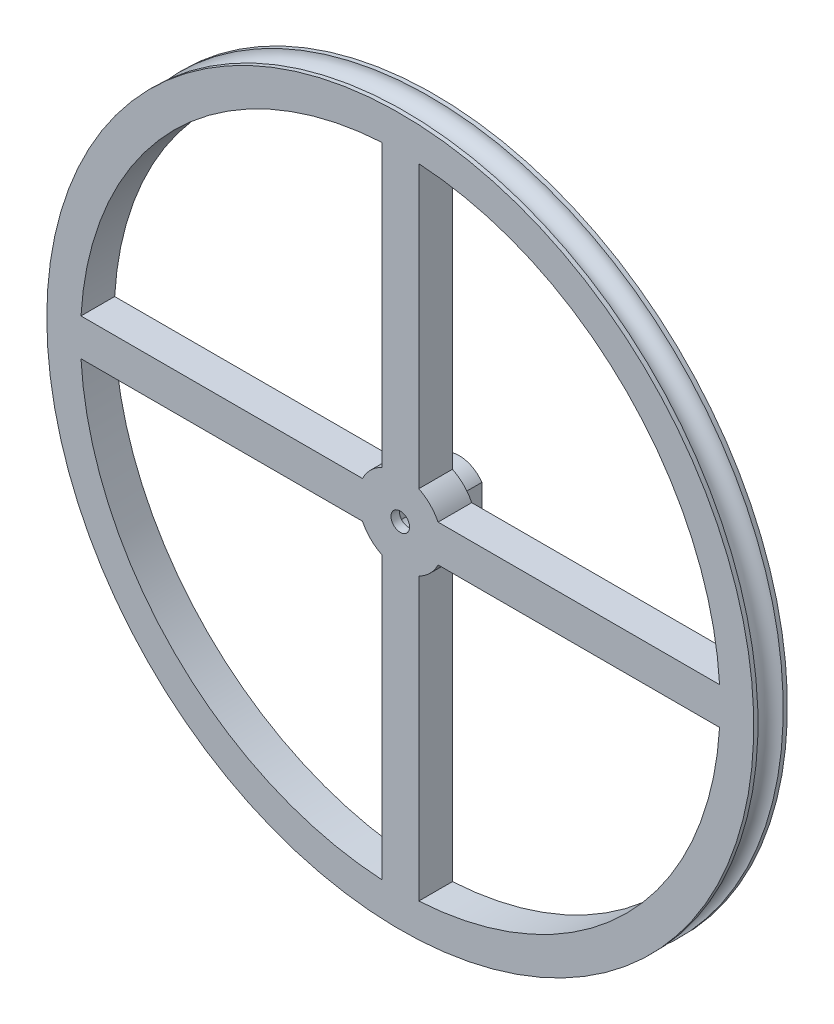
ISO-10303-21;
HEADER;
FILE_DESCRIPTION(('STEP AP214'),'2;1');
FILE_NAME('part.step','',(''),(''),'','','');
FILE_SCHEMA(('AUTOMOTIVE_DESIGN { 1 0 10303 214 1 1 1 1 }'));
ENDSEC;
DATA;
#1=APPLICATION_CONTEXT('core data for automotive mechanical design processes');
#2=APPLICATION_PROTOCOL_DEFINITION('international standard','automotive_design',2000,#1);
#3=PRODUCT_CONTEXT('',#1,'mechanical');
#4=PRODUCT('Part','Part','',(#3));
#5=PRODUCT_RELATED_PRODUCT_CATEGORY('part','',(#4));
#6=PRODUCT_DEFINITION_FORMATION('','',#4);
#7=PRODUCT_DEFINITION_CONTEXT('part definition',#1,'design');
#8=PRODUCT_DEFINITION('design','',#6,#7);
#9=PRODUCT_DEFINITION_SHAPE('','',#8);
#10=(LENGTH_UNIT() NAMED_UNIT(*) SI_UNIT(.MILLI.,.METRE.));
#11=(NAMED_UNIT(*) PLANE_ANGLE_UNIT() SI_UNIT($,.RADIAN.));
#12=(NAMED_UNIT(*) SI_UNIT($,.STERADIAN.) SOLID_ANGLE_UNIT());
#13=UNCERTAINTY_MEASURE_WITH_UNIT(LENGTH_MEASURE(1.E-05),#10,'distance_accuracy_value','');
#14=(GEOMETRIC_REPRESENTATION_CONTEXT(3) GLOBAL_UNCERTAINTY_ASSIGNED_CONTEXT((#13)) GLOBAL_UNIT_ASSIGNED_CONTEXT((#10,
#11,#12)) REPRESENTATION_CONTEXT('',''));
#15=CARTESIAN_POINT('',(0.,0.,0.));
#16=DIRECTION('',(0.,0.,1.));
#17=DIRECTION('',(1.,0.,0.));
#18=AXIS2_PLACEMENT_3D('',#15,#16,#17);
#19=CARTESIAN_POINT('',(0.,0.,5.08000000000001));
#20=DIRECTION('',(0.,0.,-1.));
#21=DIRECTION('',(-1.,0.,0.));
#22=AXIS2_PLACEMENT_3D('',#19,#20,#21);
#23=CYLINDRICAL_SURFACE('',#22,2.921);
#24=CARTESIAN_POINT('',(0.,0.,3.81));
#25=DIRECTION('',(0.,0.,1.));
#26=DIRECTION('',(1.,0.,0.));
#27=AXIS2_PLACEMENT_3D('',#24,#25,#26);
#28=CIRCLE('',#27,2.921);
#29=CARTESIAN_POINT('',(-2.159,1.96747553987337,3.81));
#30=VERTEX_POINT('',#29);
#31=CARTESIAN_POINT('',(2.159,1.96747553987337,3.81));
#32=VERTEX_POINT('',#31);
#33=EDGE_CURVE('E59',#30,#32,#28,.F.);
#34=ORIENTED_EDGE('',*,*,#33,.F.);
#35=DIRECTION('',(0.,0.,-1.));
#36=VECTOR('',#35,1.);
#37=CARTESIAN_POINT('',(-2.159,1.96747553987337,5.08000000000001));
#38=LINE('',#37,#36);
#39=CARTESIAN_POINT('',(-2.159,1.96747553987337,-3.81));
#40=VERTEX_POINT('',#39);
#41=EDGE_CURVE('E284',#30,#40,#38,.T.);
#42=ORIENTED_EDGE('',*,*,#41,.T.);
#43=CARTESIAN_POINT('',(0.,0.,-3.81));
#44=DIRECTION('',(0.,0.,-1.));
#45=DIRECTION('',(-1.,0.,0.));
#46=AXIS2_PLACEMENT_3D('',#43,#44,#45);
#47=CIRCLE('',#46,2.921);
#48=CARTESIAN_POINT('',(2.159,1.96747553987337,-3.81));
#49=VERTEX_POINT('',#48);
#50=EDGE_CURVE('E237',#40,#49,#47,.T.);
#51=ORIENTED_EDGE('',*,*,#50,.T.);
#52=DIRECTION('',(0.,0.,-1.));
#53=VECTOR('',#52,1.);
#54=CARTESIAN_POINT('',(2.159,1.96747553987337,5.08000000000001));
#55=LINE('',#54,#53);
#56=EDGE_CURVE('E215',#32,#49,#55,.T.);
#57=ORIENTED_EDGE('',*,*,#56,.F.);
#58=EDGE_LOOP('',(#34,#42,#51,#57));
#59=FACE_BOUND('',#58,.T.);
#60=ADVANCED_FACE('F43',(#59),#23,.F.);
#61=CARTESIAN_POINT('',(-2.159,1.96747553987337,5.08000000000001));
#62=DIRECTION('',(-1.,0.,0.));
#63=DIRECTION('',(0.,0.,1.));
#64=AXIS2_PLACEMENT_3D('',#61,#62,#63);
#65=PLANE('',#64);
#66=DIRECTION('',(0.,1.,0.));
#67=VECTOR('',#66,1.);
#68=CARTESIAN_POINT('',(-2.159,1.96747553987337,3.81));
#69=LINE('',#68,#67);
#70=CARTESIAN_POINT('',(-2.159,-1.96747553987337,3.81));
#71=VERTEX_POINT('',#70);
#72=EDGE_CURVE('E66',#71,#30,#69,.T.);
#73=ORIENTED_EDGE('',*,*,#72,.F.);
#74=DIRECTION('',(0.,0.,-1.));
#75=VECTOR('',#74,1.);
#76=CARTESIAN_POINT('',(-2.159,-1.96747553987337,5.08000000000001));
#77=LINE('',#76,#75);
#78=CARTESIAN_POINT('',(-2.159,-1.96747553987337,-3.81));
#79=VERTEX_POINT('',#78);
#80=EDGE_CURVE('E214',#71,#79,#77,.T.);
#81=ORIENTED_EDGE('',*,*,#80,.T.);
#82=DIRECTION('',(0.,1.,0.));
#83=VECTOR('',#82,1.);
#84=CARTESIAN_POINT('',(-2.159,-1.96747553987337,-3.81));
#85=LINE('',#84,#83);
#86=EDGE_CURVE('E230',#79,#40,#85,.T.);
#87=ORIENTED_EDGE('',*,*,#86,.T.);
#88=ORIENTED_EDGE('',*,*,#41,.F.);
#89=EDGE_LOOP('',(#73,#81,#87,#88));
#90=FACE_BOUND('',#89,.T.);
#91=ADVANCED_FACE('F510',(#90),#65,.F.);
#92=CARTESIAN_POINT('',(0.,0.,5.08000000000001));
#93=DIRECTION('',(0.,0.,-1.));
#94=DIRECTION('',(-1.,0.,0.));
#95=AXIS2_PLACEMENT_3D('',#92,#93,#94);
#96=CYLINDRICAL_SURFACE('',#95,2.921);
#97=CARTESIAN_POINT('',(0.,0.,3.81));
#98=DIRECTION('',(0.,0.,1.));
#99=DIRECTION('',(1.,0.,0.));
#100=AXIS2_PLACEMENT_3D('',#97,#98,#99);
#101=CIRCLE('',#100,2.921);
#102=CARTESIAN_POINT('',(2.159,-1.96747553987337,3.81));
#103=VERTEX_POINT('',#102);
#104=EDGE_CURVE('E218',#103,#71,#101,.F.);
#105=ORIENTED_EDGE('',*,*,#104,.F.);
#106=DIRECTION('',(0.,0.,-1.));
#107=VECTOR('',#106,1.);
#108=CARTESIAN_POINT('',(2.159,-1.96747553987337,5.08000000000001));
#109=LINE('',#108,#107);
#110=CARTESIAN_POINT('',(2.159,-1.96747553987337,-3.81));
#111=VERTEX_POINT('',#110);
#112=EDGE_CURVE('E205',#103,#111,#109,.T.);
#113=ORIENTED_EDGE('',*,*,#112,.T.);
#114=CARTESIAN_POINT('',(0.,0.,-3.81));
#115=DIRECTION('',(0.,0.,-1.));
#116=DIRECTION('',(-1.,0.,0.));
#117=AXIS2_PLACEMENT_3D('',#114,#115,#116);
#118=CIRCLE('',#117,2.921);
#119=EDGE_CURVE('E226',#111,#79,#118,.T.);
#120=ORIENTED_EDGE('',*,*,#119,.T.);
#121=ORIENTED_EDGE('',*,*,#80,.F.);
#122=EDGE_LOOP('',(#105,#113,#120,#121));
#123=FACE_BOUND('',#122,.T.);
#124=ADVANCED_FACE('F219',(#123),#96,.F.);
#125=CARTESIAN_POINT('',(2.159,1.96747553987337,5.08000000000001));
#126=DIRECTION('',(1.,0.,0.));
#127=DIRECTION('',(0.,0.,-1.));
#128=AXIS2_PLACEMENT_3D('',#125,#126,#127);
#129=PLANE('',#128);
#130=DIRECTION('',(0.,-1.,0.));
#131=VECTOR('',#130,1.);
#132=CARTESIAN_POINT('',(2.159,1.96747553987337,3.81));
#133=LINE('',#132,#131);
#134=EDGE_CURVE('E11',#32,#103,#133,.T.);
#135=ORIENTED_EDGE('',*,*,#134,.F.);
#136=ORIENTED_EDGE('',*,*,#56,.T.);
#137=DIRECTION('',(0.,-1.,0.));
#138=VECTOR('',#137,1.);
#139=CARTESIAN_POINT('',(2.159,1.96747553987337,-3.81));
#140=LINE('',#139,#138);
#141=EDGE_CURVE('E209',#49,#111,#140,.T.);
#142=ORIENTED_EDGE('',*,*,#141,.T.);
#143=ORIENTED_EDGE('',*,*,#112,.F.);
#144=EDGE_LOOP('',(#135,#136,#142,#143));
#145=FACE_BOUND('',#144,.T.);
#146=ADVANCED_FACE('F207',(#145),#129,.F.);
#147=CARTESIAN_POINT('',(0.,0.,0.));
#148=DIRECTION('',(0.,0.,-1.));
#149=DIRECTION('',(-1.,0.,0.));
#150=AXIS2_PLACEMENT_3D('',#147,#148,#149);
#151=PLANE('',#150);
#152=CARTESIAN_POINT('',(0.,0.,0.));
#153=DIRECTION('',(0.,0.,-1.));
#154=DIRECTION('',(-1.,0.,0.));
#155=AXIS2_PLACEMENT_3D('',#152,#153,#154);
#156=CIRCLE('',#155,53.34);
#157=CARTESIAN_POINT('',(-53.34,0.,0.));
#158=VERTEX_POINT('',#157);
#159=EDGE_CURVE('E458',#158,#158,#156,.T.);
#160=ORIENTED_EDGE('',*,*,#159,.T.);
#161=EDGE_LOOP('',(#160));
#162=FACE_BOUND('',#161,.T.);
#163=CARTESIAN_POINT('',(0.,0.,0.));
#164=DIRECTION('',(0.,0.,-1.));
#165=DIRECTION('',(1.,0.,0.));
#166=AXIS2_PLACEMENT_3D('',#163,#164,#165);
#167=CIRCLE('',#166,48.26);
#168=CARTESIAN_POINT('',(-48.1790531662879,2.794,0.));
#169=VERTEX_POINT('',#168);
#170=CARTESIAN_POINT('',(-2.79400000000001,48.1790531662879,0.));
#171=VERTEX_POINT('',#170);
#172=EDGE_CURVE('E323',#169,#171,#167,.T.);
#173=ORIENTED_EDGE('',*,*,#172,.F.);
#174=DIRECTION('',(-1.,0.,0.));
#175=VECTOR('',#174,1.);
#176=CARTESIAN_POINT('',(-5.70228585744349,2.794,0.));
#177=LINE('',#176,#175);
#178=CARTESIAN_POINT('',(-5.70228585744349,2.794,0.));
#179=VERTEX_POINT('',#178);
#180=EDGE_CURVE('E429',#179,#169,#177,.T.);
#181=ORIENTED_EDGE('',*,*,#180,.F.);
#182=CARTESIAN_POINT('',(0.,0.,0.));
#183=DIRECTION('',(0.,0.,1.));
#184=DIRECTION('',(1.,0.,0.));
#185=AXIS2_PLACEMENT_3D('',#182,#183,#184);
#186=CIRCLE('',#185,6.35);
#187=CARTESIAN_POINT('',(-2.794,5.70228585744349,0.));
#188=VERTEX_POINT('',#187);
#189=EDGE_CURVE('E448',#188,#179,#186,.T.);
#190=ORIENTED_EDGE('',*,*,#189,.F.);
#191=DIRECTION('',(0.,-1.,0.));
#192=VECTOR('',#191,1.);
#193=CARTESIAN_POINT('',(-2.79400000000001,48.1790531662879,0.));
#194=LINE('',#193,#192);
#195=EDGE_CURVE('E444',#171,#188,#194,.T.);
#196=ORIENTED_EDGE('',*,*,#195,.F.);
#197=EDGE_LOOP('',(#173,#181,#190,#196));
#198=FACE_BOUND('',#197,.T.);
#199=CARTESIAN_POINT('',(0.,0.,0.));
#200=DIRECTION('',(0.,0.,-1.));
#201=DIRECTION('',(1.,0.,0.));
#202=AXIS2_PLACEMENT_3D('',#199,#200,#201);
#203=CIRCLE('',#202,48.26);
#204=CARTESIAN_POINT('',(-2.794,-48.1790531662879,0.));
#205=VERTEX_POINT('',#204);
#206=CARTESIAN_POINT('',(-48.1790531662879,-2.79400000000001,0.));
#207=VERTEX_POINT('',#206);
#208=EDGE_CURVE('E320',#205,#207,#203,.T.);
#209=ORIENTED_EDGE('',*,*,#208,.F.);
#210=DIRECTION('',(0.,-1.,0.));
#211=VECTOR('',#210,1.);
#212=CARTESIAN_POINT('',(-2.794,-5.70228585744349,0.));
#213=LINE('',#212,#211);
#214=CARTESIAN_POINT('',(-2.794,-5.70228585744349,0.));
#215=VERTEX_POINT('',#214);
#216=EDGE_CURVE('E307',#215,#205,#213,.T.);
#217=ORIENTED_EDGE('',*,*,#216,.F.);
#218=CARTESIAN_POINT('',(0.,0.,0.));
#219=DIRECTION('',(0.,0.,1.));
#220=DIRECTION('',(1.,0.,0.));
#221=AXIS2_PLACEMENT_3D('',#218,#219,#220);
#222=CIRCLE('',#221,6.35);
#223=CARTESIAN_POINT('',(-5.70228585744349,-2.794,0.));
#224=VERTEX_POINT('',#223);
#225=EDGE_CURVE('E311',#224,#215,#222,.T.);
#226=ORIENTED_EDGE('',*,*,#225,.F.);
#227=DIRECTION('',(1.,0.,0.));
#228=VECTOR('',#227,1.);
#229=CARTESIAN_POINT('',(-48.1790531662879,-2.79400000000001,0.));
#230=LINE('',#229,#228);
#231=EDGE_CURVE('E316',#207,#224,#230,.T.);
#232=ORIENTED_EDGE('',*,*,#231,.F.);
#233=EDGE_LOOP('',(#209,#217,#226,#232));
#234=FACE_BOUND('',#233,.T.);
#235=CARTESIAN_POINT('',(0.,0.,0.));
#236=DIRECTION('',(0.,0.,-1.));
#237=DIRECTION('',(1.,0.,0.));
#238=AXIS2_PLACEMENT_3D('',#235,#236,#237);
#239=CIRCLE('',#238,48.26);
#240=CARTESIAN_POINT('',(48.1790531662879,-2.79400000000001,0.));
#241=VERTEX_POINT('',#240);
#242=CARTESIAN_POINT('',(2.79400000000001,-48.1790531662879,0.));
#243=VERTEX_POINT('',#242);
#244=EDGE_CURVE('E306',#241,#243,#239,.T.);
#245=ORIENTED_EDGE('',*,*,#244,.F.);
#246=DIRECTION('',(1.,0.,0.));
#247=VECTOR('',#246,1.);
#248=CARTESIAN_POINT('',(5.70228585744349,-2.794,0.));
#249=LINE('',#248,#247);
#250=CARTESIAN_POINT('',(5.70228585744349,-2.794,0.));
#251=VERTEX_POINT('',#250);
#252=EDGE_CURVE('E353',#251,#241,#249,.T.);
#253=ORIENTED_EDGE('',*,*,#252,.F.);
#254=CARTESIAN_POINT('',(0.,0.,0.));
#255=DIRECTION('',(0.,0.,1.));
#256=DIRECTION('',(1.,0.,0.));
#257=AXIS2_PLACEMENT_3D('',#254,#255,#256);
#258=CIRCLE('',#257,6.35);
#259=CARTESIAN_POINT('',(2.794,-5.70228585744349,0.));
#260=VERTEX_POINT('',#259);
#261=EDGE_CURVE('E357',#260,#251,#258,.T.);
#262=ORIENTED_EDGE('',*,*,#261,.F.);
#263=DIRECTION('',(0.,1.,0.));
#264=VECTOR('',#263,1.);
#265=CARTESIAN_POINT('',(2.79400000000001,-48.1790531662879,0.));
#266=LINE('',#265,#264);
#267=EDGE_CURVE('E362',#243,#260,#266,.T.);
#268=ORIENTED_EDGE('',*,*,#267,.F.);
#269=EDGE_LOOP('',(#245,#253,#262,#268));
#270=FACE_BOUND('',#269,.T.);
#271=CARTESIAN_POINT('',(0.,0.,0.));
#272=DIRECTION('',(0.,0.,-1.));
#273=DIRECTION('',(1.,0.,0.));
#274=AXIS2_PLACEMENT_3D('',#271,#272,#273);
#275=CIRCLE('',#274,48.26);
#276=CARTESIAN_POINT('',(2.79400000000001,48.1790531662879,0.));
#277=VERTEX_POINT('',#276);
#278=CARTESIAN_POINT('',(48.1790531662879,2.79400000000001,0.));
#279=VERTEX_POINT('',#278);
#280=EDGE_CURVE('E352',#277,#279,#275,.T.);
#281=ORIENTED_EDGE('',*,*,#280,.F.);
#282=DIRECTION('',(0.,1.,0.));
#283=VECTOR('',#282,1.);
#284=CARTESIAN_POINT('',(2.794,5.70228585744349,0.));
#285=LINE('',#284,#283);
#286=CARTESIAN_POINT('',(2.794,5.70228585744349,0.));
#287=VERTEX_POINT('',#286);
#288=EDGE_CURVE('E395',#287,#277,#285,.T.);
#289=ORIENTED_EDGE('',*,*,#288,.F.);
#290=CARTESIAN_POINT('',(0.,0.,0.));
#291=DIRECTION('',(0.,0.,1.));
#292=DIRECTION('',(1.,0.,0.));
#293=AXIS2_PLACEMENT_3D('',#290,#291,#292);
#294=CIRCLE('',#293,6.35);
#295=CARTESIAN_POINT('',(5.70228585744349,2.794,0.));
#296=VERTEX_POINT('',#295);
#297=EDGE_CURVE('E399',#296,#287,#294,.T.);
#298=ORIENTED_EDGE('',*,*,#297,.F.);
#299=DIRECTION('',(-1.,0.,0.));
#300=VECTOR('',#299,1.);
#301=CARTESIAN_POINT('',(48.1790531662879,2.79400000000001,0.));
#302=LINE('',#301,#300);
#303=EDGE_CURVE('E404',#279,#296,#302,.T.);
#304=ORIENTED_EDGE('',*,*,#303,.F.);
#305=EDGE_LOOP('',(#281,#289,#298,#304));
#306=FACE_BOUND('',#305,.T.);
#307=DIRECTION('',(0.,1.,0.));
#308=VECTOR('',#307,1.);
#309=CARTESIAN_POINT('',(-3.429,-2.40965557704831,0.));
#310=LINE('',#309,#308);
#311=CARTESIAN_POINT('',(-3.429,-2.40965557704831,0.));
#312=VERTEX_POINT('',#311);
#313=CARTESIAN_POINT('',(-3.429,2.40965557704831,0.));
#314=VERTEX_POINT('',#313);
#315=EDGE_CURVE('E262',#312,#314,#310,.T.);
#316=ORIENTED_EDGE('',*,*,#315,.F.);
#317=CARTESIAN_POINT('',(0.,0.,0.));
#318=DIRECTION('',(0.,0.,-1.));
#319=DIRECTION('',(-1.,0.,0.));
#320=AXIS2_PLACEMENT_3D('',#317,#318,#319);
#321=CIRCLE('',#320,4.191);
#322=CARTESIAN_POINT('',(3.429,-2.40965557704831,0.));
#323=VERTEX_POINT('',#322);
#324=EDGE_CURVE('E243',#323,#312,#321,.T.);
#325=ORIENTED_EDGE('',*,*,#324,.F.);
#326=DIRECTION('',(0.,-1.,0.));
#327=VECTOR('',#326,1.);
#328=CARTESIAN_POINT('',(3.429,2.40965557704831,0.));
#329=LINE('',#328,#327);
#330=CARTESIAN_POINT('',(3.429,2.40965557704831,0.));
#331=VERTEX_POINT('',#330);
#332=EDGE_CURVE('E249',#331,#323,#329,.T.);
#333=ORIENTED_EDGE('',*,*,#332,.F.);
#334=CARTESIAN_POINT('',(0.,0.,0.));
#335=DIRECTION('',(0.,0.,-1.));
#336=DIRECTION('',(-1.,0.,0.));
#337=AXIS2_PLACEMENT_3D('',#334,#335,#336);
#338=CIRCLE('',#337,4.191);
#339=EDGE_CURVE('E265',#314,#331,#338,.T.);
#340=ORIENTED_EDGE('',*,*,#339,.F.);
#341=EDGE_LOOP('',(#316,#325,#333,#340));
#342=FACE_BOUND('',#341,.T.);
#343=ADVANCED_FACE('F487',(#162,#198,#234,#270,#306,#342),#151,.T.);
#344=CARTESIAN_POINT('',(0.,0.,5.08));
#345=DIRECTION('',(0.,0.,1.));
#346=DIRECTION('',(1.,0.,0.));
#347=AXIS2_PLACEMENT_3D('',#344,#345,#346);
#348=PLANE('',#347);
#349=CARTESIAN_POINT('',(0.,0.,5.08000000000001));
#350=DIRECTION('',(0.,0.,-1.));
#351=DIRECTION('',(1.,0.,0.));
#352=AXIS2_PLACEMENT_3D('',#349,#350,#351);
#353=CIRCLE('',#352,48.26);
#354=CARTESIAN_POINT('',(2.79400000000001,48.1790531662879,5.08000000000001));
#355=VERTEX_POINT('',#354);
#356=CARTESIAN_POINT('',(48.1790531662879,2.79400000000001,5.08000000000001));
#357=VERTEX_POINT('',#356);
#358=EDGE_CURVE('E400',#355,#357,#353,.T.);
#359=ORIENTED_EDGE('',*,*,#358,.T.);
#360=DIRECTION('',(-1.,0.,0.));
#361=VECTOR('',#360,1.);
#362=CARTESIAN_POINT('',(48.1790531662879,2.79400000000001,5.08000000000001));
#363=LINE('',#362,#361);
#364=CARTESIAN_POINT('',(5.70228585744349,2.794,5.08));
#365=VERTEX_POINT('',#364);
#366=EDGE_CURVE('E417',#357,#365,#363,.T.);
#367=ORIENTED_EDGE('',*,*,#366,.T.);
#368=CARTESIAN_POINT('',(0.,0.,5.08000000000001));
#369=DIRECTION('',(0.,0.,1.));
#370=DIRECTION('',(1.,0.,0.));
#371=AXIS2_PLACEMENT_3D('',#368,#369,#370);
#372=CIRCLE('',#371,6.35);
#373=CARTESIAN_POINT('',(2.794,5.70228585744349,5.08000000000001));
#374=VERTEX_POINT('',#373);
#375=EDGE_CURVE('E413',#365,#374,#372,.T.);
#376=ORIENTED_EDGE('',*,*,#375,.T.);
#377=DIRECTION('',(0.,1.,0.));
#378=VECTOR('',#377,1.);
#379=CARTESIAN_POINT('',(2.794,5.70228585744349,5.08000000000001));
#380=LINE('',#379,#378);
#381=EDGE_CURVE('E386',#374,#355,#380,.T.);
#382=ORIENTED_EDGE('',*,*,#381,.T.);
#383=EDGE_LOOP('',(#359,#367,#376,#382));
#384=FACE_BOUND('',#383,.T.);
#385=CARTESIAN_POINT('',(0.,0.,5.08000000000001));
#386=DIRECTION('',(0.,0.,-1.));
#387=DIRECTION('',(1.,0.,0.));
#388=AXIS2_PLACEMENT_3D('',#385,#386,#387);
#389=CIRCLE('',#388,48.26);
#390=CARTESIAN_POINT('',(48.1790531662879,-2.79400000000001,5.08000000000001));
#391=VERTEX_POINT('',#390);
#392=CARTESIAN_POINT('',(2.79400000000001,-48.1790531662879,5.08000000000001));
#393=VERTEX_POINT('',#392);
#394=EDGE_CURVE('E358',#391,#393,#389,.T.);
#395=ORIENTED_EDGE('',*,*,#394,.T.);
#396=DIRECTION('',(0.,1.,0.));
#397=VECTOR('',#396,1.);
#398=CARTESIAN_POINT('',(2.79400000000001,-48.1790531662879,5.08000000000001));
#399=LINE('',#398,#397);
#400=CARTESIAN_POINT('',(2.794,-5.70228585744349,5.08));
#401=VERTEX_POINT('',#400);
#402=EDGE_CURVE('E375',#393,#401,#399,.T.);
#403=ORIENTED_EDGE('',*,*,#402,.T.);
#404=CARTESIAN_POINT('',(0.,0.,5.08000000000001));
#405=DIRECTION('',(0.,0.,1.));
#406=DIRECTION('',(1.,0.,0.));
#407=AXIS2_PLACEMENT_3D('',#404,#405,#406);
#408=CIRCLE('',#407,6.35);
#409=CARTESIAN_POINT('',(5.70228585744349,-2.794,5.08000000000001));
#410=VERTEX_POINT('',#409);
#411=EDGE_CURVE('E371',#401,#410,#408,.T.);
#412=ORIENTED_EDGE('',*,*,#411,.T.);
#413=DIRECTION('',(1.,0.,0.));
#414=VECTOR('',#413,1.);
#415=CARTESIAN_POINT('',(5.70228585744349,-2.794,5.08000000000001));
#416=LINE('',#415,#414);
#417=EDGE_CURVE('E342',#410,#391,#416,.T.);
#418=ORIENTED_EDGE('',*,*,#417,.T.);
#419=EDGE_LOOP('',(#395,#403,#412,#418));
#420=FACE_BOUND('',#419,.T.);
#421=CARTESIAN_POINT('',(0.,0.,5.08000000000001));
#422=DIRECTION('',(0.,0.,-1.));
#423=DIRECTION('',(1.,0.,0.));
#424=AXIS2_PLACEMENT_3D('',#421,#422,#423);
#425=CIRCLE('',#424,48.26);
#426=CARTESIAN_POINT('',(-2.794,-48.1790531662879,5.08000000000001));
#427=VERTEX_POINT('',#426);
#428=CARTESIAN_POINT('',(-48.1790531662879,-2.79400000000001,5.08000000000001));
#429=VERTEX_POINT('',#428);
#430=EDGE_CURVE('E312',#427,#429,#425,.T.);
#431=ORIENTED_EDGE('',*,*,#430,.T.);
#432=DIRECTION('',(1.,0.,0.));
#433=VECTOR('',#432,1.);
#434=CARTESIAN_POINT('',(-48.1790531662879,-2.79400000000001,5.08000000000001));
#435=LINE('',#434,#433);
#436=CARTESIAN_POINT('',(-5.70228585744349,-2.794,5.08));
#437=VERTEX_POINT('',#436);
#438=EDGE_CURVE('E331',#429,#437,#435,.T.);
#439=ORIENTED_EDGE('',*,*,#438,.T.);
#440=CARTESIAN_POINT('',(0.,0.,5.08000000000001));
#441=DIRECTION('',(0.,0.,1.));
#442=DIRECTION('',(1.,0.,0.));
#443=AXIS2_PLACEMENT_3D('',#440,#441,#442);
#444=CIRCLE('',#443,6.35);
#445=CARTESIAN_POINT('',(-2.794,-5.70228585744349,5.08000000000001));
#446=VERTEX_POINT('',#445);
#447=EDGE_CURVE('E327',#437,#446,#444,.T.);
#448=ORIENTED_EDGE('',*,*,#447,.T.);
#449=DIRECTION('',(0.,-1.,0.));
#450=VECTOR('',#449,1.);
#451=CARTESIAN_POINT('',(-2.794,-5.70228585744349,5.08000000000001));
#452=LINE('',#451,#450);
#453=EDGE_CURVE('E296',#446,#427,#452,.T.);
#454=ORIENTED_EDGE('',*,*,#453,.T.);
#455=EDGE_LOOP('',(#431,#439,#448,#454));
#456=FACE_BOUND('',#455,.T.);
#457=CARTESIAN_POINT('',(0.,0.,5.08000000000001));
#458=DIRECTION('',(0.,0.,-1.));
#459=DIRECTION('',(1.,0.,0.));
#460=AXIS2_PLACEMENT_3D('',#457,#458,#459);
#461=CIRCLE('',#460,48.26);
#462=CARTESIAN_POINT('',(-48.1790531662879,2.794,5.08000000000001));
#463=VERTEX_POINT('',#462);
#464=CARTESIAN_POINT('',(-2.79400000000001,48.1790531662879,5.08000000000001));
#465=VERTEX_POINT('',#464);
#466=EDGE_CURVE('E424',#463,#465,#461,.T.);
#467=ORIENTED_EDGE('',*,*,#466,.T.);
#468=DIRECTION('',(0.,-1.,0.));
#469=VECTOR('',#468,1.);
#470=CARTESIAN_POINT('',(-2.79400000000001,48.1790531662879,5.08000000000001));
#471=LINE('',#470,#469);
#472=CARTESIAN_POINT('',(-2.794,5.70228585744349,5.08));
#473=VERTEX_POINT('',#472);
#474=EDGE_CURVE('E428',#465,#473,#471,.T.);
#475=ORIENTED_EDGE('',*,*,#474,.T.);
#476=CARTESIAN_POINT('',(0.,0.,5.08000000000001));
#477=DIRECTION('',(0.,0.,1.));
#478=DIRECTION('',(1.,0.,0.));
#479=AXIS2_PLACEMENT_3D('',#476,#477,#478);
#480=CIRCLE('',#479,6.35);
#481=CARTESIAN_POINT('',(-5.70228585744349,2.794,5.08000000000001));
#482=VERTEX_POINT('',#481);
#483=EDGE_CURVE('E433',#473,#482,#480,.T.);
#484=ORIENTED_EDGE('',*,*,#483,.T.);
#485=DIRECTION('',(-1.,0.,0.));
#486=VECTOR('',#485,1.);
#487=CARTESIAN_POINT('',(-5.70228585744349,2.794,5.08000000000001));
#488=LINE('',#487,#486);
#489=EDGE_CURVE('E437',#482,#463,#488,.T.);
#490=ORIENTED_EDGE('',*,*,#489,.T.);
#491=EDGE_LOOP('',(#467,#475,#484,#490));
#492=FACE_BOUND('',#491,.T.);
#493=CARTESIAN_POINT('',(0.,0.,5.08));
#494=DIRECTION('',(0.,0.,-1.));
#495=DIRECTION('',(-1.,0.,0.));
#496=AXIS2_PLACEMENT_3D('',#493,#494,#495);
#497=CIRCLE('',#496,53.34);
#498=CARTESIAN_POINT('',(-53.34,0.,5.08000000000001));
#499=VERTEX_POINT('',#498);
#500=EDGE_CURVE('E52',#499,#499,#497,.T.);
#501=ORIENTED_EDGE('',*,*,#500,.F.);
#502=EDGE_LOOP('',(#501));
#503=FACE_BOUND('',#502,.T.);
#504=CARTESIAN_POINT('',(0.,0.,5.08));
#505=DIRECTION('',(0.,0.,1.));
#506=DIRECTION('',(1.,0.,0.));
#507=AXIS2_PLACEMENT_3D('',#504,#505,#506);
#508=CIRCLE('',#507,1.397);
#509=CARTESIAN_POINT('',(1.397,0.,5.08));
#510=VERTEX_POINT('',#509);
#511=EDGE_CURVE('E491',#510,#510,#508,.T.);
#512=ORIENTED_EDGE('',*,*,#511,.F.);
#513=EDGE_LOOP('',(#512));
#514=FACE_BOUND('',#513,.T.);
#515=ADVANCED_FACE('F45',(#384,#420,#456,#492,#503,#514),#348,.T.);
#516=CARTESIAN_POINT('',(0.,0.,0.));
#517=DIRECTION('',(0.,0.,-1.));
#518=DIRECTION('',(-1.,0.,0.));
#519=AXIS2_PLACEMENT_3D('',#516,#517,#518);
#520=CYLINDRICAL_SURFACE('',#519,53.34);
#521=ORIENTED_EDGE('',*,*,#500,.T.);
#522=EDGE_LOOP('',(#521));
#523=FACE_BOUND('',#522,.T.);
#524=CARTESIAN_POINT('',(0.,0.,4.445));
#525=DIRECTION('',(0.,0.,-1.));
#526=DIRECTION('',(-1.,0.,0.));
#527=AXIS2_PLACEMENT_3D('',#524,#525,#526);
#528=CIRCLE('',#527,53.34);
#529=CARTESIAN_POINT('',(-53.34,0.,4.44500000000001));
#530=VERTEX_POINT('',#529);
#531=EDGE_CURVE('E475',#530,#530,#528,.T.);
#532=ORIENTED_EDGE('',*,*,#531,.F.);
#533=EDGE_LOOP('',(#532));
#534=FACE_BOUND('',#533,.T.);
#535=ADVANCED_FACE('F482',(#523,#534),#520,.T.);
#536=CARTESIAN_POINT('',(0.,0.,2.54));
#537=DIRECTION('',(0.,0.,-1.));
#538=DIRECTION('',(-1.,0.,0.));
#539=AXIS2_PLACEMENT_3D('',#536,#537,#538);
#540=TOROIDAL_SURFACE('',#539,53.34,1.905);
#541=ORIENTED_EDGE('',*,*,#531,.T.);
#542=EDGE_LOOP('',(#541));
#543=FACE_BOUND('',#542,.T.);
#544=CARTESIAN_POINT('',(0.,0.,0.634999999999994));
#545=DIRECTION('',(0.,0.,-1.));
#546=DIRECTION('',(-1.,0.,0.));
#547=AXIS2_PLACEMENT_3D('',#544,#545,#546);
#548=CIRCLE('',#547,53.34);
#549=CARTESIAN_POINT('',(-53.34,0.,0.635000000000001));
#550=VERTEX_POINT('',#549);
#551=EDGE_CURVE('E471',#550,#550,#548,.T.);
#552=ORIENTED_EDGE('',*,*,#551,.F.);
#553=EDGE_LOOP('',(#552));
#554=FACE_BOUND('',#553,.T.);
#555=ADVANCED_FACE('F591',(#543,#554),#540,.F.);
#556=CARTESIAN_POINT('',(0.,0.,0.));
#557=DIRECTION('',(0.,0.,-1.));
#558=DIRECTION('',(-1.,0.,0.));
#559=AXIS2_PLACEMENT_3D('',#556,#557,#558);
#560=CYLINDRICAL_SURFACE('',#559,53.34);
#561=ORIENTED_EDGE('',*,*,#551,.T.);
#562=EDGE_LOOP('',(#561));
#563=FACE_BOUND('',#562,.T.);
#564=ORIENTED_EDGE('',*,*,#159,.F.);
#565=EDGE_LOOP('',(#564));
#566=FACE_BOUND('',#565,.T.);
#567=ADVANCED_FACE('F584',(#563,#566),#560,.T.);
#568=CARTESIAN_POINT('',(0.,0.,5.08000000000001));
#569=DIRECTION('',(0.,0.,-1.));
#570=DIRECTION('',(-1.,0.,0.));
#571=AXIS2_PLACEMENT_3D('',#568,#569,#570);
#572=CYLINDRICAL_SURFACE('',#571,48.26);
#573=ORIENTED_EDGE('',*,*,#172,.T.);
#574=DIRECTION('',(0.,0.,-1.));
#575=VECTOR('',#574,1.);
#576=CARTESIAN_POINT('',(-2.79400000000001,48.1790531662879,5.08000000000001));
#577=LINE('',#576,#575);
#578=EDGE_CURVE('E441',#465,#171,#577,.T.);
#579=ORIENTED_EDGE('',*,*,#578,.F.);
#580=ORIENTED_EDGE('',*,*,#466,.F.);
#581=DIRECTION('',(0.,0.,-1.));
#582=VECTOR('',#581,1.);
#583=CARTESIAN_POINT('',(-48.1790531662879,2.794,5.08000000000001));
#584=LINE('',#583,#582);
#585=EDGE_CURVE('E455',#463,#169,#584,.T.);
#586=ORIENTED_EDGE('',*,*,#585,.T.);
#587=EDGE_LOOP('',(#573,#579,#580,#586));
#588=FACE_BOUND('',#587,.T.);
#589=ADVANCED_FACE('F574',(#588),#572,.F.);
#590=CARTESIAN_POINT('',(-5.70228585744349,2.794,5.08000000000001));
#591=DIRECTION('',(0.,-1.,0.));
#592=DIRECTION('',(0.,0.,-1.));
#593=AXIS2_PLACEMENT_3D('',#590,#591,#592);
#594=PLANE('',#593);
#595=ORIENTED_EDGE('',*,*,#180,.T.);
#596=ORIENTED_EDGE('',*,*,#585,.F.);
#597=ORIENTED_EDGE('',*,*,#489,.F.);
#598=DIRECTION('',(0.,0.,-1.));
#599=VECTOR('',#598,1.);
#600=CARTESIAN_POINT('',(-5.70228585744349,2.794,5.08000000000001));
#601=LINE('',#600,#599);
#602=EDGE_CURVE('E459',#482,#179,#601,.T.);
#603=ORIENTED_EDGE('',*,*,#602,.T.);
#604=EDGE_LOOP('',(#595,#596,#597,#603));
#605=FACE_BOUND('',#604,.T.);
#606=ADVANCED_FACE('F570',(#605),#594,.F.);
#607=CARTESIAN_POINT('',(0.,0.,5.08000000000001));
#608=DIRECTION('',(0.,0.,-1.));
#609=DIRECTION('',(-1.,0.,0.));
#610=AXIS2_PLACEMENT_3D('',#607,#608,#609);
#611=CYLINDRICAL_SURFACE('',#610,6.35);
#612=ORIENTED_EDGE('',*,*,#189,.T.);
#613=ORIENTED_EDGE('',*,*,#602,.F.);
#614=ORIENTED_EDGE('',*,*,#483,.F.);
#615=DIRECTION('',(0.,0.,-1.));
#616=VECTOR('',#615,1.);
#617=CARTESIAN_POINT('',(-2.794,5.70228585744349,5.08000000000001));
#618=LINE('',#617,#616);
#619=EDGE_CURVE('E462',#473,#188,#618,.T.);
#620=ORIENTED_EDGE('',*,*,#619,.T.);
#621=EDGE_LOOP('',(#612,#613,#614,#620));
#622=FACE_BOUND('',#621,.T.);
#623=ADVANCED_FACE('F573',(#622),#611,.T.);
#624=CARTESIAN_POINT('',(-2.79400000000001,48.1790531662879,5.08000000000001));
#625=DIRECTION('',(1.,0.,0.));
#626=DIRECTION('',(0.,1.,0.));
#627=AXIS2_PLACEMENT_3D('',#624,#625,#626);
#628=PLANE('',#627);
#629=ORIENTED_EDGE('',*,*,#195,.T.);
#630=ORIENTED_EDGE('',*,*,#619,.F.);
#631=ORIENTED_EDGE('',*,*,#474,.F.);
#632=ORIENTED_EDGE('',*,*,#578,.T.);
#633=EDGE_LOOP('',(#629,#630,#631,#632));
#634=FACE_BOUND('',#633,.T.);
#635=ADVANCED_FACE('F524',(#634),#628,.F.);
#636=CARTESIAN_POINT('',(0.,0.,5.08000000000001));
#637=DIRECTION('',(0.,0.,-1.));
#638=DIRECTION('',(-1.,0.,0.));
#639=AXIS2_PLACEMENT_3D('',#636,#637,#638);
#640=CYLINDRICAL_SURFACE('',#639,48.26);
#641=ORIENTED_EDGE('',*,*,#208,.T.);
#642=DIRECTION('',(0.,0.,-1.));
#643=VECTOR('',#642,1.);
#644=CARTESIAN_POINT('',(-48.1790531662879,-2.79400000000001,5.08000000000001));
#645=LINE('',#644,#643);
#646=EDGE_CURVE('E292',#429,#207,#645,.T.);
#647=ORIENTED_EDGE('',*,*,#646,.F.);
#648=ORIENTED_EDGE('',*,*,#430,.F.);
#649=DIRECTION('',(0.,0.,-1.));
#650=VECTOR('',#649,1.);
#651=CARTESIAN_POINT('',(-2.794,-48.1790531662879,5.08000000000001));
#652=LINE('',#651,#650);
#653=EDGE_CURVE('E303',#427,#205,#652,.T.);
#654=ORIENTED_EDGE('',*,*,#653,.T.);
#655=EDGE_LOOP('',(#641,#647,#648,#654));
#656=FACE_BOUND('',#655,.T.);
#657=ADVANCED_FACE('F520',(#656),#640,.F.);
#658=CARTESIAN_POINT('',(-2.794,-5.70228585744349,5.08000000000001));
#659=DIRECTION('',(1.,0.,0.));
#660=DIRECTION('',(0.,1.,0.));
#661=AXIS2_PLACEMENT_3D('',#658,#659,#660);
#662=PLANE('',#661);
#663=ORIENTED_EDGE('',*,*,#216,.T.);
#664=ORIENTED_EDGE('',*,*,#653,.F.);
#665=ORIENTED_EDGE('',*,*,#453,.F.);
#666=DIRECTION('',(0.,0.,-1.));
#667=VECTOR('',#666,1.);
#668=CARTESIAN_POINT('',(-2.794,-5.70228585744349,5.08000000000001));
#669=LINE('',#668,#667);
#670=EDGE_CURVE('E300',#446,#215,#669,.T.);
#671=ORIENTED_EDGE('',*,*,#670,.T.);
#672=EDGE_LOOP('',(#663,#664,#665,#671));
#673=FACE_BOUND('',#672,.T.);
#674=ADVANCED_FACE('F523',(#673),#662,.F.);
#675=CARTESIAN_POINT('',(0.,0.,5.08000000000001));
#676=DIRECTION('',(0.,0.,-1.));
#677=DIRECTION('',(-1.,0.,0.));
#678=AXIS2_PLACEMENT_3D('',#675,#676,#677);
#679=CYLINDRICAL_SURFACE('',#678,6.35);
#680=ORIENTED_EDGE('',*,*,#225,.T.);
#681=ORIENTED_EDGE('',*,*,#670,.F.);
#682=ORIENTED_EDGE('',*,*,#447,.F.);
#683=DIRECTION('',(0.,0.,-1.));
#684=VECTOR('',#683,1.);
#685=CARTESIAN_POINT('',(-5.70228585744349,-2.794,5.08000000000001));
#686=LINE('',#685,#684);
#687=EDGE_CURVE('E297',#437,#224,#686,.T.);
#688=ORIENTED_EDGE('',*,*,#687,.T.);
#689=EDGE_LOOP('',(#680,#681,#682,#688));
#690=FACE_BOUND('',#689,.T.);
#691=ADVANCED_FACE('F530',(#690),#679,.T.);
#692=CARTESIAN_POINT('',(-48.1790531662879,-2.79400000000001,5.08000000000001));
#693=DIRECTION('',(0.,1.,0.));
#694=DIRECTION('',(-1.,0.,0.));
#695=AXIS2_PLACEMENT_3D('',#692,#693,#694);
#696=PLANE('',#695);
#697=ORIENTED_EDGE('',*,*,#231,.T.);
#698=ORIENTED_EDGE('',*,*,#687,.F.);
#699=ORIENTED_EDGE('',*,*,#438,.F.);
#700=ORIENTED_EDGE('',*,*,#646,.T.);
#701=EDGE_LOOP('',(#697,#698,#699,#700));
#702=FACE_BOUND('',#701,.T.);
#703=ADVANCED_FACE('F526',(#702),#696,.F.);
#704=CARTESIAN_POINT('',(0.,0.,5.08000000000001));
#705=DIRECTION('',(0.,0.,-1.));
#706=DIRECTION('',(-1.,0.,0.));
#707=AXIS2_PLACEMENT_3D('',#704,#705,#706);
#708=CYLINDRICAL_SURFACE('',#707,48.26);
#709=ORIENTED_EDGE('',*,*,#244,.T.);
#710=DIRECTION('',(0.,0.,-1.));
#711=VECTOR('',#710,1.);
#712=CARTESIAN_POINT('',(2.79400000000001,-48.1790531662879,5.08000000000001));
#713=LINE('',#712,#711);
#714=EDGE_CURVE('E338',#393,#243,#713,.T.);
#715=ORIENTED_EDGE('',*,*,#714,.F.);
#716=ORIENTED_EDGE('',*,*,#394,.F.);
#717=DIRECTION('',(0.,0.,-1.));
#718=VECTOR('',#717,1.);
#719=CARTESIAN_POINT('',(48.1790531662879,-2.79400000000001,5.08000000000001));
#720=LINE('',#719,#718);
#721=EDGE_CURVE('E349',#391,#241,#720,.T.);
#722=ORIENTED_EDGE('',*,*,#721,.T.);
#723=EDGE_LOOP('',(#709,#715,#716,#722));
#724=FACE_BOUND('',#723,.T.);
#725=ADVANCED_FACE('F529',(#724),#708,.F.);
#726=CARTESIAN_POINT('',(5.70228585744349,-2.794,5.08000000000001));
#727=DIRECTION('',(0.,1.,0.));
#728=DIRECTION('',(-1.,0.,0.));
#729=AXIS2_PLACEMENT_3D('',#726,#727,#728);
#730=PLANE('',#729);
#731=ORIENTED_EDGE('',*,*,#252,.T.);
#732=ORIENTED_EDGE('',*,*,#721,.F.);
#733=ORIENTED_EDGE('',*,*,#417,.F.);
#734=DIRECTION('',(0.,0.,-1.));
#735=VECTOR('',#734,1.);
#736=CARTESIAN_POINT('',(5.70228585744349,-2.794,5.08000000000001));
#737=LINE('',#736,#735);
#738=EDGE_CURVE('E346',#410,#251,#737,.T.);
#739=ORIENTED_EDGE('',*,*,#738,.T.);
#740=EDGE_LOOP('',(#731,#732,#733,#739));
#741=FACE_BOUND('',#740,.T.);
#742=ADVANCED_FACE('F540',(#741),#730,.F.);
#743=CARTESIAN_POINT('',(0.,0.,5.08000000000001));
#744=DIRECTION('',(0.,0.,-1.));
#745=DIRECTION('',(-1.,0.,0.));
#746=AXIS2_PLACEMENT_3D('',#743,#744,#745);
#747=CYLINDRICAL_SURFACE('',#746,6.35);
#748=ORIENTED_EDGE('',*,*,#261,.T.);
#749=ORIENTED_EDGE('',*,*,#738,.F.);
#750=ORIENTED_EDGE('',*,*,#411,.F.);
#751=DIRECTION('',(0.,0.,-1.));
#752=VECTOR('',#751,1.);
#753=CARTESIAN_POINT('',(2.794,-5.70228585744349,5.08000000000001));
#754=LINE('',#753,#752);
#755=EDGE_CURVE('E343',#401,#260,#754,.T.);
#756=ORIENTED_EDGE('',*,*,#755,.T.);
#757=EDGE_LOOP('',(#748,#749,#750,#756));
#758=FACE_BOUND('',#757,.T.);
#759=ADVANCED_FACE('F546',(#758),#747,.T.);
#760=CARTESIAN_POINT('',(2.79400000000001,-48.1790531662879,5.08000000000001));
#761=DIRECTION('',(-1.,0.,0.));
#762=DIRECTION('',(0.,-1.,0.));
#763=AXIS2_PLACEMENT_3D('',#760,#761,#762);
#764=PLANE('',#763);
#765=ORIENTED_EDGE('',*,*,#267,.T.);
#766=ORIENTED_EDGE('',*,*,#755,.F.);
#767=ORIENTED_EDGE('',*,*,#402,.F.);
#768=ORIENTED_EDGE('',*,*,#714,.T.);
#769=EDGE_LOOP('',(#765,#766,#767,#768));
#770=FACE_BOUND('',#769,.T.);
#771=ADVANCED_FACE('F542',(#770),#764,.F.);
#772=CARTESIAN_POINT('',(0.,0.,5.08000000000001));
#773=DIRECTION('',(0.,0.,-1.));
#774=DIRECTION('',(-1.,0.,0.));
#775=AXIS2_PLACEMENT_3D('',#772,#773,#774);
#776=CYLINDRICAL_SURFACE('',#775,48.26);
#777=ORIENTED_EDGE('',*,*,#280,.T.);
#778=DIRECTION('',(0.,0.,-1.));
#779=VECTOR('',#778,1.);
#780=CARTESIAN_POINT('',(48.1790531662879,2.79400000000001,5.08000000000001));
#781=LINE('',#780,#779);
#782=EDGE_CURVE('E382',#357,#279,#781,.T.);
#783=ORIENTED_EDGE('',*,*,#782,.F.);
#784=ORIENTED_EDGE('',*,*,#358,.F.);
#785=DIRECTION('',(0.,0.,-1.));
#786=VECTOR('',#785,1.);
#787=CARTESIAN_POINT('',(2.79400000000001,48.1790531662879,5.08000000000001));
#788=LINE('',#787,#786);
#789=EDGE_CURVE('E287',#355,#277,#788,.T.);
#790=ORIENTED_EDGE('',*,*,#789,.T.);
#791=EDGE_LOOP('',(#777,#783,#784,#790));
#792=FACE_BOUND('',#791,.T.);
#793=ADVANCED_FACE('F545',(#792),#776,.F.);
#794=CARTESIAN_POINT('',(2.794,5.70228585744349,5.08000000000001));
#795=DIRECTION('',(-1.,0.,0.));
#796=DIRECTION('',(0.,-1.,0.));
#797=AXIS2_PLACEMENT_3D('',#794,#795,#796);
#798=PLANE('',#797);
#799=ORIENTED_EDGE('',*,*,#288,.T.);
#800=ORIENTED_EDGE('',*,*,#789,.F.);
#801=ORIENTED_EDGE('',*,*,#381,.F.);
#802=DIRECTION('',(0.,0.,-1.));
#803=VECTOR('',#802,1.);
#804=CARTESIAN_POINT('',(2.794,5.70228585744349,5.08000000000001));
#805=LINE('',#804,#803);
#806=EDGE_CURVE('E390',#374,#287,#805,.T.);
#807=ORIENTED_EDGE('',*,*,#806,.T.);
#808=EDGE_LOOP('',(#799,#800,#801,#807));
#809=FACE_BOUND('',#808,.T.);
#810=ADVANCED_FACE('F556',(#809),#798,.F.);
#811=CARTESIAN_POINT('',(0.,0.,5.08000000000001));
#812=DIRECTION('',(0.,0.,-1.));
#813=DIRECTION('',(-1.,0.,0.));
#814=AXIS2_PLACEMENT_3D('',#811,#812,#813);
#815=CYLINDRICAL_SURFACE('',#814,6.35);
#816=ORIENTED_EDGE('',*,*,#297,.T.);
#817=ORIENTED_EDGE('',*,*,#806,.F.);
#818=ORIENTED_EDGE('',*,*,#375,.F.);
#819=DIRECTION('',(0.,0.,-1.));
#820=VECTOR('',#819,1.);
#821=CARTESIAN_POINT('',(5.70228585744349,2.794,5.08000000000001));
#822=LINE('',#821,#820);
#823=EDGE_CURVE('E387',#365,#296,#822,.T.);
#824=ORIENTED_EDGE('',*,*,#823,.T.);
#825=EDGE_LOOP('',(#816,#817,#818,#824));
#826=FACE_BOUND('',#825,.T.);
#827=ADVANCED_FACE('F562',(#826),#815,.T.);
#828=CARTESIAN_POINT('',(48.1790531662879,2.79400000000001,5.08000000000001));
#829=DIRECTION('',(0.,-1.,0.));
#830=DIRECTION('',(1.,0.,0.));
#831=AXIS2_PLACEMENT_3D('',#828,#829,#830);
#832=PLANE('',#831);
#833=ORIENTED_EDGE('',*,*,#303,.T.);
#834=ORIENTED_EDGE('',*,*,#823,.F.);
#835=ORIENTED_EDGE('',*,*,#366,.F.);
#836=ORIENTED_EDGE('',*,*,#782,.T.);
#837=EDGE_LOOP('',(#833,#834,#835,#836));
#838=FACE_BOUND('',#837,.T.);
#839=ADVANCED_FACE('F558',(#838),#832,.F.);
#840=CARTESIAN_POINT('',(0.,0.,-3.81));
#841=DIRECTION('',(0.,0.,-1.));
#842=DIRECTION('',(-1.,0.,0.));
#843=AXIS2_PLACEMENT_3D('',#840,#841,#842);
#844=PLANE('',#843);
#845=CARTESIAN_POINT('',(0.,0.,-3.81));
#846=DIRECTION('',(0.,0.,-1.));
#847=DIRECTION('',(-1.,0.,0.));
#848=AXIS2_PLACEMENT_3D('',#845,#846,#847);
#849=CIRCLE('',#848,4.191);
#850=CARTESIAN_POINT('',(3.429,-2.40965557704831,-3.81));
#851=VERTEX_POINT('',#850);
#852=CARTESIAN_POINT('',(-3.429,-2.40965557704831,-3.81));
#853=VERTEX_POINT('',#852);
#854=EDGE_CURVE('E244',#851,#853,#849,.T.);
#855=ORIENTED_EDGE('',*,*,#854,.T.);
#856=DIRECTION('',(0.,1.,0.));
#857=VECTOR('',#856,1.);
#858=CARTESIAN_POINT('',(-3.429,-2.40965557704831,-3.81));
#859=LINE('',#858,#857);
#860=CARTESIAN_POINT('',(-3.429,2.40965557704831,-3.81));
#861=VERTEX_POINT('',#860);
#862=EDGE_CURVE('E248',#853,#861,#859,.T.);
#863=ORIENTED_EDGE('',*,*,#862,.T.);
#864=CARTESIAN_POINT('',(0.,0.,-3.81));
#865=DIRECTION('',(0.,0.,-1.));
#866=DIRECTION('',(-1.,0.,0.));
#867=AXIS2_PLACEMENT_3D('',#864,#865,#866);
#868=CIRCLE('',#867,4.191);
#869=CARTESIAN_POINT('',(3.429,2.40965557704831,-3.81));
#870=VERTEX_POINT('',#869);
#871=EDGE_CURVE('E252',#861,#870,#868,.T.);
#872=ORIENTED_EDGE('',*,*,#871,.T.);
#873=DIRECTION('',(0.,-1.,0.));
#874=VECTOR('',#873,1.);
#875=CARTESIAN_POINT('',(3.429,2.40965557704831,-3.81));
#876=LINE('',#875,#874);
#877=EDGE_CURVE('E255',#870,#851,#876,.T.);
#878=ORIENTED_EDGE('',*,*,#877,.T.);
#879=EDGE_LOOP('',(#855,#863,#872,#878));
#880=FACE_BOUND('',#879,.T.);
#881=ORIENTED_EDGE('',*,*,#86,.F.);
#882=ORIENTED_EDGE('',*,*,#119,.F.);
#883=ORIENTED_EDGE('',*,*,#141,.F.);
#884=ORIENTED_EDGE('',*,*,#50,.F.);
#885=EDGE_LOOP('',(#881,#882,#883,#884));
#886=FACE_BOUND('',#885,.T.);
#887=ADVANCED_FACE('F561',(#880,#886),#844,.T.);
#888=CARTESIAN_POINT('',(0.,0.,-3.81));
#889=DIRECTION('',(0.,0.,1.));
#890=DIRECTION('',(1.,0.,0.));
#891=AXIS2_PLACEMENT_3D('',#888,#889,#890);
#892=CYLINDRICAL_SURFACE('',#891,4.191);
#893=ORIENTED_EDGE('',*,*,#324,.T.);
#894=DIRECTION('',(0.,0.,1.));
#895=VECTOR('',#894,1.);
#896=CARTESIAN_POINT('',(-3.429,-2.40965557704831,-3.81));
#897=LINE('',#896,#895);
#898=EDGE_CURVE('E281',#853,#312,#897,.T.);
#899=ORIENTED_EDGE('',*,*,#898,.F.);
#900=ORIENTED_EDGE('',*,*,#854,.F.);
#901=DIRECTION('',(0.,0.,1.));
#902=VECTOR('',#901,1.);
#903=CARTESIAN_POINT('',(3.429,-2.40965557704831,-3.81));
#904=LINE('',#903,#902);
#905=EDGE_CURVE('E258',#851,#323,#904,.T.);
#906=ORIENTED_EDGE('',*,*,#905,.T.);
#907=EDGE_LOOP('',(#893,#899,#900,#906));
#908=FACE_BOUND('',#907,.T.);
#909=ADVANCED_FACE('F683',(#908),#892,.T.);
#910=CARTESIAN_POINT('',(-3.429,-2.40965557704831,-3.81));
#911=DIRECTION('',(1.,0.,0.));
#912=DIRECTION('',(0.,0.,-1.));
#913=AXIS2_PLACEMENT_3D('',#910,#911,#912);
#914=PLANE('',#913);
#915=ORIENTED_EDGE('',*,*,#315,.T.);
#916=DIRECTION('',(0.,0.,1.));
#917=VECTOR('',#916,1.);
#918=CARTESIAN_POINT('',(-3.429,2.40965557704831,-3.81));
#919=LINE('',#918,#917);
#920=EDGE_CURVE('E277',#861,#314,#919,.T.);
#921=ORIENTED_EDGE('',*,*,#920,.F.);
#922=ORIENTED_EDGE('',*,*,#862,.F.);
#923=ORIENTED_EDGE('',*,*,#898,.T.);
#924=EDGE_LOOP('',(#915,#921,#922,#923));
#925=FACE_BOUND('',#924,.T.);
#926=ADVANCED_FACE('F690',(#925),#914,.F.);
#927=CARTESIAN_POINT('',(0.,0.,-3.81));
#928=DIRECTION('',(0.,0.,1.));
#929=DIRECTION('',(1.,0.,0.));
#930=AXIS2_PLACEMENT_3D('',#927,#928,#929);
#931=CYLINDRICAL_SURFACE('',#930,4.191);
#932=ORIENTED_EDGE('',*,*,#339,.T.);
#933=DIRECTION('',(0.,0.,1.));
#934=VECTOR('',#933,1.);
#935=CARTESIAN_POINT('',(3.429,2.40965557704831,-3.81));
#936=LINE('',#935,#934);
#937=EDGE_CURVE('E274',#870,#331,#936,.T.);
#938=ORIENTED_EDGE('',*,*,#937,.F.);
#939=ORIENTED_EDGE('',*,*,#871,.F.);
#940=ORIENTED_EDGE('',*,*,#920,.T.);
#941=EDGE_LOOP('',(#932,#938,#939,#940));
#942=FACE_BOUND('',#941,.T.);
#943=ADVANCED_FACE('F698',(#942),#931,.T.);
#944=CARTESIAN_POINT('',(3.429,2.40965557704831,-3.81));
#945=DIRECTION('',(-1.,0.,0.));
#946=DIRECTION('',(0.,0.,1.));
#947=AXIS2_PLACEMENT_3D('',#944,#945,#946);
#948=PLANE('',#947);
#949=ORIENTED_EDGE('',*,*,#332,.T.);
#950=ORIENTED_EDGE('',*,*,#905,.F.);
#951=ORIENTED_EDGE('',*,*,#877,.F.);
#952=ORIENTED_EDGE('',*,*,#937,.T.);
#953=EDGE_LOOP('',(#949,#950,#951,#952));
#954=FACE_BOUND('',#953,.T.);
#955=ADVANCED_FACE('F507',(#954),#948,.F.);
#956=CARTESIAN_POINT('',(0.,0.,3.81));
#957=DIRECTION('',(0.,0.,1.));
#958=DIRECTION('',(1.,0.,0.));
#959=AXIS2_PLACEMENT_3D('',#956,#957,#958);
#960=PLANE('',#959);
#961=CARTESIAN_POINT('',(0.,0.,3.81));
#962=DIRECTION('',(0.,0.,1.));
#963=DIRECTION('',(1.,0.,0.));
#964=AXIS2_PLACEMENT_3D('',#961,#962,#963);
#965=CIRCLE('',#964,1.397);
#966=CARTESIAN_POINT('',(1.397,0.,3.81));
#967=VERTEX_POINT('',#966);
#968=EDGE_CURVE('E222',#967,#967,#965,.T.);
#969=ORIENTED_EDGE('',*,*,#968,.T.);
#970=EDGE_LOOP('',(#969));
#971=FACE_BOUND('',#970,.T.);
#972=ORIENTED_EDGE('',*,*,#72,.T.);
#973=ORIENTED_EDGE('',*,*,#33,.T.);
#974=ORIENTED_EDGE('',*,*,#134,.T.);
#975=ORIENTED_EDGE('',*,*,#104,.T.);
#976=EDGE_LOOP('',(#972,#973,#974,#975));
#977=FACE_BOUND('',#976,.T.);
#978=ADVANCED_FACE('F224',(#971,#977),#960,.F.);
#979=CARTESIAN_POINT('',(0.,0.,3.81));
#980=DIRECTION('',(0.,0.,1.));
#981=DIRECTION('',(1.,0.,0.));
#982=AXIS2_PLACEMENT_3D('',#979,#980,#981);
#983=CYLINDRICAL_SURFACE('',#982,1.397);
#984=ORIENTED_EDGE('',*,*,#968,.F.);
#985=EDGE_LOOP('',(#984));
#986=FACE_BOUND('',#985,.T.);
#987=ORIENTED_EDGE('',*,*,#511,.T.);
#988=EDGE_LOOP('',(#987));
#989=FACE_BOUND('',#988,.T.);
#990=ADVANCED_FACE('F501',(#986,#989),#983,.F.);
#991=CLOSED_SHELL('',(#60,#91,#124,#146,#343,#515,#535,#555,#567,#589,#606,#623,#635,#657,#674,
#691,#703,#725,#742,#759,#771,#793,#810,#827,#839,#887,#909,#926,#943,#955,#978,#990));
#992=MANIFOLD_SOLID_BREP('B2',#991);
#993=ADVANCED_BREP_SHAPE_REPRESENTATION('',(#18,#992),#14);
#994=SHAPE_DEFINITION_REPRESENTATION(#9,#993);
ENDSEC;
END-ISO-10303-21;
